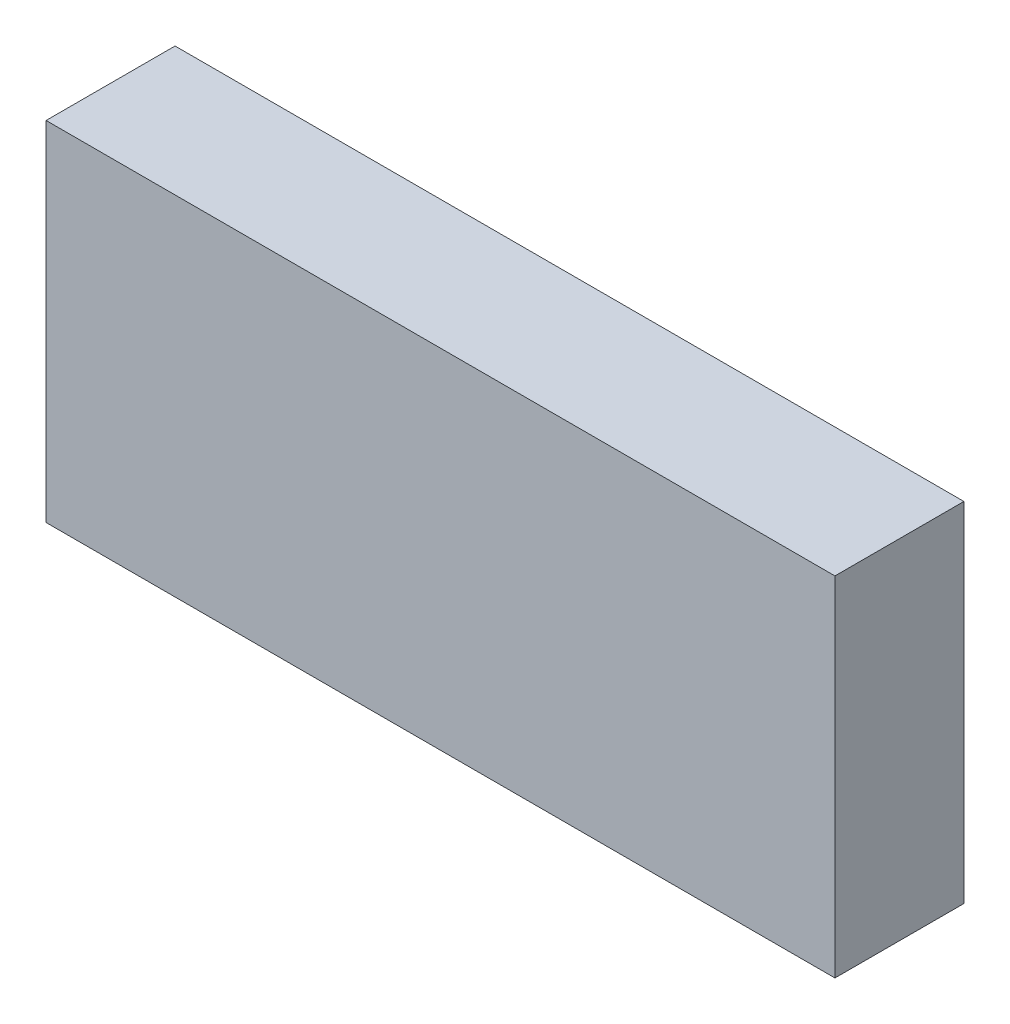
ISO-10303-21;
HEADER;
FILE_DESCRIPTION(('STEP AP214'),'2;1');
FILE_NAME('part.step','',(''),(''),'','','');
FILE_SCHEMA(('AUTOMOTIVE_DESIGN { 1 0 10303 214 1 1 1 1 }'));
ENDSEC;
DATA;
#1=APPLICATION_CONTEXT('core data for automotive mechanical design processes');
#2=APPLICATION_PROTOCOL_DEFINITION('international standard','automotive_design',2000,#1);
#3=PRODUCT_CONTEXT('',#1,'mechanical');
#4=PRODUCT('Part','Part','',(#3));
#5=PRODUCT_RELATED_PRODUCT_CATEGORY('part','',(#4));
#6=PRODUCT_DEFINITION_FORMATION('','',#4);
#7=PRODUCT_DEFINITION_CONTEXT('part definition',#1,'design');
#8=PRODUCT_DEFINITION('design','',#6,#7);
#9=PRODUCT_DEFINITION_SHAPE('','',#8);
#10=(LENGTH_UNIT() NAMED_UNIT(*) SI_UNIT(.MILLI.,.METRE.));
#11=(NAMED_UNIT(*) PLANE_ANGLE_UNIT() SI_UNIT($,.RADIAN.));
#12=(NAMED_UNIT(*) SI_UNIT($,.STERADIAN.) SOLID_ANGLE_UNIT());
#13=UNCERTAINTY_MEASURE_WITH_UNIT(LENGTH_MEASURE(1.E-05),#10,'distance_accuracy_value','');
#14=(GEOMETRIC_REPRESENTATION_CONTEXT(3) GLOBAL_UNCERTAINTY_ASSIGNED_CONTEXT((#13)) GLOBAL_UNIT_ASSIGNED_CONTEXT((#10,
#11,#12)) REPRESENTATION_CONTEXT('',''));
#15=CARTESIAN_POINT('',(0.,0.,0.));
#16=DIRECTION('',(0.,0.,1.));
#17=DIRECTION('',(1.,0.,0.));
#18=AXIS2_PLACEMENT_3D('',#15,#16,#17);
#19=CARTESIAN_POINT('',(-2.33045,1.0287,0.762));
#20=DIRECTION('',(0.,0.,-1.));
#21=DIRECTION('',(-1.,0.,0.));
#22=AXIS2_PLACEMENT_3D('',#19,#20,#21);
#23=PLANE('',#22);
#24=DIRECTION('',(1.,0.,0.));
#25=VECTOR('',#24,1.);
#26=CARTESIAN_POINT('',(-2.33045,-1.0287,0.762));
#27=LINE('',#26,#25);
#28=CARTESIAN_POINT('',(-2.33045,-1.0287,0.762));
#29=VERTEX_POINT('',#28);
#30=CARTESIAN_POINT('',(2.33045,-1.0287,0.762));
#31=VERTEX_POINT('',#30);
#32=EDGE_CURVE('E55',#29,#31,#27,.T.);
#33=ORIENTED_EDGE('',*,*,#32,.T.);
#34=DIRECTION('',(0.,1.,0.));
#35=VECTOR('',#34,1.);
#36=CARTESIAN_POINT('',(2.33045,-1.0287,0.762));
#37=LINE('',#36,#35);
#38=CARTESIAN_POINT('',(2.33045,1.0287,0.762));
#39=VERTEX_POINT('',#38);
#40=EDGE_CURVE('E57',#31,#39,#37,.T.);
#41=ORIENTED_EDGE('',*,*,#40,.T.);
#42=DIRECTION('',(1.,0.,0.));
#43=VECTOR('',#42,1.);
#44=CARTESIAN_POINT('',(2.33045,1.0287,0.762));
#45=LINE('',#44,#43);
#46=CARTESIAN_POINT('',(-2.33045,1.0287,0.762));
#47=VERTEX_POINT('',#46);
#48=EDGE_CURVE('E20',#39,#47,#45,.F.);
#49=ORIENTED_EDGE('',*,*,#48,.T.);
#50=DIRECTION('',(0.,1.,0.));
#51=VECTOR('',#50,1.);
#52=CARTESIAN_POINT('',(-2.33045,1.0287,0.762));
#53=LINE('',#52,#51);
#54=EDGE_CURVE('E80',#47,#29,#53,.F.);
#55=ORIENTED_EDGE('',*,*,#54,.T.);
#56=EDGE_LOOP('',(#33,#41,#49,#55));
#57=FACE_BOUND('',#56,.T.);
#58=ADVANCED_FACE('F17',(#57),#23,.F.);
#59=CARTESIAN_POINT('',(2.33045,1.0287,0.));
#60=DIRECTION('',(0.,-1.,0.));
#61=DIRECTION('',(0.,0.,-1.));
#62=AXIS2_PLACEMENT_3D('',#59,#60,#61);
#63=PLANE('',#62);
#64=DIRECTION('',(0.,0.,-1.));
#65=VECTOR('',#64,1.);
#66=CARTESIAN_POINT('',(-2.33045,1.0287,0.));
#67=LINE('',#66,#65);
#68=CARTESIAN_POINT('',(-2.33045,1.0287,0.));
#69=VERTEX_POINT('',#68);
#70=EDGE_CURVE('E68',#69,#47,#67,.F.);
#71=ORIENTED_EDGE('',*,*,#70,.T.);
#72=ORIENTED_EDGE('',*,*,#48,.F.);
#73=DIRECTION('',(0.,0.,1.));
#74=VECTOR('',#73,1.);
#75=CARTESIAN_POINT('',(2.33045,1.0287,0.));
#76=LINE('',#75,#74);
#77=CARTESIAN_POINT('',(2.33045,1.0287,0.));
#78=VERTEX_POINT('',#77);
#79=EDGE_CURVE('E63',#39,#78,#76,.F.);
#80=ORIENTED_EDGE('',*,*,#79,.T.);
#81=DIRECTION('',(-1.,0.,0.));
#82=VECTOR('',#81,1.);
#83=CARTESIAN_POINT('',(-2.33045,1.0287,0.));
#84=LINE('',#83,#82);
#85=EDGE_CURVE('E83',#69,#78,#84,.F.);
#86=ORIENTED_EDGE('',*,*,#85,.F.);
#87=EDGE_LOOP('',(#71,#72,#80,#86));
#88=FACE_BOUND('',#87,.T.);
#89=ADVANCED_FACE('F65',(#88),#63,.F.);
#90=CARTESIAN_POINT('',(2.33045,-1.0287,0.));
#91=DIRECTION('',(-1.,0.,0.));
#92=DIRECTION('',(0.,0.,1.));
#93=AXIS2_PLACEMENT_3D('',#90,#91,#92);
#94=PLANE('',#93);
#95=ORIENTED_EDGE('',*,*,#79,.F.);
#96=ORIENTED_EDGE('',*,*,#40,.F.);
#97=DIRECTION('',(0.,0.,1.));
#98=VECTOR('',#97,1.);
#99=CARTESIAN_POINT('',(2.33045,-1.0287,0.));
#100=LINE('',#99,#98);
#101=CARTESIAN_POINT('',(2.33045,-1.0287,0.));
#102=VERTEX_POINT('',#101);
#103=EDGE_CURVE('E75',#31,#102,#100,.F.);
#104=ORIENTED_EDGE('',*,*,#103,.T.);
#105=DIRECTION('',(0.,1.,0.));
#106=VECTOR('',#105,1.);
#107=CARTESIAN_POINT('',(2.33045,1.0287,0.));
#108=LINE('',#107,#106);
#109=EDGE_CURVE('E72',#78,#102,#108,.F.);
#110=ORIENTED_EDGE('',*,*,#109,.F.);
#111=EDGE_LOOP('',(#95,#96,#104,#110));
#112=FACE_BOUND('',#111,.T.);
#113=ADVANCED_FACE('F70',(#112),#94,.F.);
#114=CARTESIAN_POINT('',(-2.33045,-1.0287,0.));
#115=DIRECTION('',(0.,1.,0.));
#116=DIRECTION('',(0.,0.,1.));
#117=AXIS2_PLACEMENT_3D('',#114,#115,#116);
#118=PLANE('',#117);
#119=ORIENTED_EDGE('',*,*,#103,.F.);
#120=ORIENTED_EDGE('',*,*,#32,.F.);
#121=DIRECTION('',(0.,0.,-1.));
#122=VECTOR('',#121,1.);
#123=CARTESIAN_POINT('',(-2.33045,-1.0287,0.));
#124=LINE('',#123,#122);
#125=CARTESIAN_POINT('',(-2.33045,-1.0287,0.));
#126=VERTEX_POINT('',#125);
#127=EDGE_CURVE('E35',#29,#126,#124,.T.);
#128=ORIENTED_EDGE('',*,*,#127,.T.);
#129=DIRECTION('',(-1.,0.,0.));
#130=VECTOR('',#129,1.);
#131=CARTESIAN_POINT('',(-2.33045,-1.0287,0.));
#132=LINE('',#131,#130);
#133=EDGE_CURVE('E26',#102,#126,#132,.T.);
#134=ORIENTED_EDGE('',*,*,#133,.F.);
#135=EDGE_LOOP('',(#119,#120,#128,#134));
#136=FACE_BOUND('',#135,.T.);
#137=ADVANCED_FACE('F89',(#136),#118,.F.);
#138=CARTESIAN_POINT('',(-2.33045,1.0287,0.));
#139=DIRECTION('',(1.,0.,0.));
#140=DIRECTION('',(0.,0.,-1.));
#141=AXIS2_PLACEMENT_3D('',#138,#139,#140);
#142=PLANE('',#141);
#143=ORIENTED_EDGE('',*,*,#127,.F.);
#144=ORIENTED_EDGE('',*,*,#54,.F.);
#145=ORIENTED_EDGE('',*,*,#70,.F.);
#146=DIRECTION('',(0.,1.,0.));
#147=VECTOR('',#146,1.);
#148=CARTESIAN_POINT('',(-2.33045,1.0287,0.));
#149=LINE('',#148,#147);
#150=EDGE_CURVE('E11',#126,#69,#149,.T.);
#151=ORIENTED_EDGE('',*,*,#150,.F.);
#152=EDGE_LOOP('',(#143,#144,#145,#151));
#153=FACE_BOUND('',#152,.T.);
#154=ADVANCED_FACE('F91',(#153),#142,.F.);
#155=CARTESIAN_POINT('',(-2.33045,1.0287,0.));
#156=DIRECTION('',(0.,0.,-1.));
#157=DIRECTION('',(-1.,0.,0.));
#158=AXIS2_PLACEMENT_3D('',#155,#156,#157);
#159=PLANE('',#158);
#160=ORIENTED_EDGE('',*,*,#133,.T.);
#161=ORIENTED_EDGE('',*,*,#150,.T.);
#162=ORIENTED_EDGE('',*,*,#85,.T.);
#163=ORIENTED_EDGE('',*,*,#109,.T.);
#164=EDGE_LOOP('',(#160,#161,#162,#163));
#165=FACE_BOUND('',#164,.T.);
#166=ADVANCED_FACE('F88',(#165),#159,.T.);
#167=CLOSED_SHELL('',(#58,#89,#113,#137,#154,#166));
#168=MANIFOLD_SOLID_BREP('B1',#167);
#169=ADVANCED_BREP_SHAPE_REPRESENTATION('',(#18,#168),#14);
#170=SHAPE_DEFINITION_REPRESENTATION(#9,#169);
ENDSEC;
END-ISO-10303-21;
